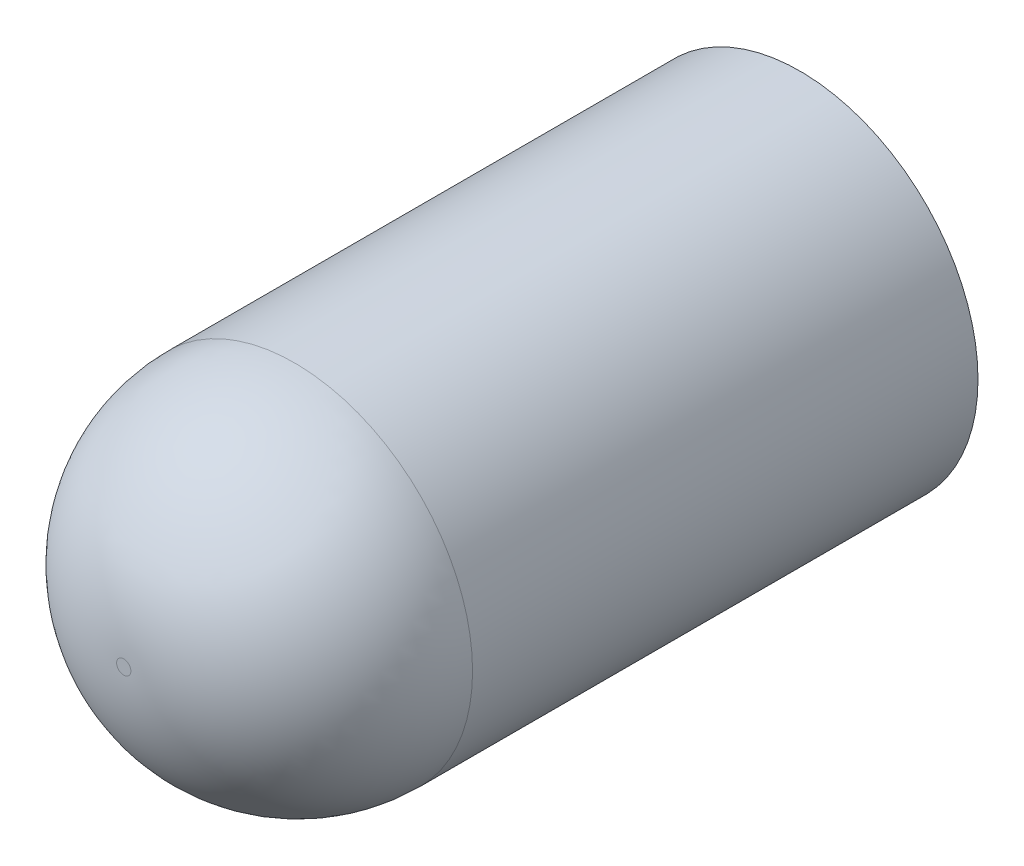
ISO-10303-21;
HEADER;
FILE_DESCRIPTION(('STEP AP214'),'2;1');
FILE_NAME('part.step','',(''),(''),'','','');
FILE_SCHEMA(('AUTOMOTIVE_DESIGN { 1 0 10303 214 1 1 1 1 }'));
ENDSEC;
DATA;
#1=APPLICATION_CONTEXT('core data for automotive mechanical design processes');
#2=APPLICATION_PROTOCOL_DEFINITION('international standard','automotive_design',2000,#1);
#3=PRODUCT_CONTEXT('',#1,'mechanical');
#4=PRODUCT('Part','Part','',(#3));
#5=PRODUCT_RELATED_PRODUCT_CATEGORY('part','',(#4));
#6=PRODUCT_DEFINITION_FORMATION('','',#4);
#7=PRODUCT_DEFINITION_CONTEXT('part definition',#1,'design');
#8=PRODUCT_DEFINITION('design','',#6,#7);
#9=PRODUCT_DEFINITION_SHAPE('','',#8);
#10=(LENGTH_UNIT() NAMED_UNIT(*) SI_UNIT(.MILLI.,.METRE.));
#11=(NAMED_UNIT(*) PLANE_ANGLE_UNIT() SI_UNIT($,.RADIAN.));
#12=(NAMED_UNIT(*) SI_UNIT($,.STERADIAN.) SOLID_ANGLE_UNIT());
#13=UNCERTAINTY_MEASURE_WITH_UNIT(LENGTH_MEASURE(1.E-05),#10,'distance_accuracy_value','');
#14=(GEOMETRIC_REPRESENTATION_CONTEXT(3) GLOBAL_UNCERTAINTY_ASSIGNED_CONTEXT((#13)) GLOBAL_UNIT_ASSIGNED_CONTEXT((#10,
#11,#12)) REPRESENTATION_CONTEXT('',''));
#15=CARTESIAN_POINT('',(0.,0.,0.));
#16=DIRECTION('',(0.,0.,1.));
#17=DIRECTION('',(1.,0.,0.));
#18=AXIS2_PLACEMENT_3D('',#15,#16,#17);
#19=CARTESIAN_POINT('',(0.,15.,-7.));
#20=DIRECTION('',(0.,0.,1.));
#21=DIRECTION('',(1.,0.,0.));
#22=AXIS2_PLACEMENT_3D('',#19,#20,#21);
#23=CYLINDRICAL_SURFACE('',#22,2.5);
#24=CARTESIAN_POINT('',(0.,15.,0.1));
#25=DIRECTION('',(0.,0.,1.));
#26=DIRECTION('',(1.,0.,0.));
#27=AXIS2_PLACEMENT_3D('',#24,#25,#26);
#28=CIRCLE('',#27,2.5);
#29=CARTESIAN_POINT('',(2.50000000000001,15.,0.1));
#30=VERTEX_POINT('',#29);
#31=EDGE_CURVE('E10',#30,#30,#28,.F.);
#32=ORIENTED_EDGE('',*,*,#31,.T.);
#33=EDGE_LOOP('',(#32));
#34=FACE_BOUND('',#33,.T.);
#35=CARTESIAN_POINT('',(0.,15.,-7.));
#36=DIRECTION('',(0.,0.,1.));
#37=DIRECTION('',(1.,0.,0.));
#38=AXIS2_PLACEMENT_3D('',#35,#36,#37);
#39=CIRCLE('',#38,2.5);
#40=CARTESIAN_POINT('',(2.50000000000001,15.,-7.));
#41=VERTEX_POINT('',#40);
#42=EDGE_CURVE('E46',#41,#41,#39,.T.);
#43=ORIENTED_EDGE('',*,*,#42,.T.);
#44=EDGE_LOOP('',(#43));
#45=FACE_BOUND('',#44,.T.);
#46=ADVANCED_FACE('F35',(#34,#45),#23,.T.);
#47=CARTESIAN_POINT('',(0.,15.,-7.));
#48=DIRECTION('',(0.,0.,1.));
#49=DIRECTION('',(1.,0.,0.));
#50=AXIS2_PLACEMENT_3D('',#47,#48,#49);
#51=PLANE('',#50);
#52=ORIENTED_EDGE('',*,*,#42,.F.);
#53=EDGE_LOOP('',(#52));
#54=FACE_BOUND('',#53,.T.);
#55=ADVANCED_FACE('F54',(#54),#51,.F.);
#56=CARTESIAN_POINT('',(0.,15.,2.5));
#57=DIRECTION('',(0.,0.,1.));
#58=DIRECTION('',(1.,0.,0.));
#59=AXIS2_PLACEMENT_3D('',#56,#57,#58);
#60=PLANE('',#59);
#61=CARTESIAN_POINT('',(0.,15.,2.5));
#62=DIRECTION('',(0.,0.,1.));
#63=DIRECTION('',(1.,0.,0.));
#64=AXIS2_PLACEMENT_3D('',#61,#62,#63);
#65=CIRCLE('',#64,0.1);
#66=CARTESIAN_POINT('',(0.100000000000011,15.,2.5));
#67=VERTEX_POINT('',#66);
#68=EDGE_CURVE('E42',#67,#67,#65,.T.);
#69=ORIENTED_EDGE('',*,*,#68,.T.);
#70=EDGE_LOOP('',(#69));
#71=FACE_BOUND('',#70,.T.);
#72=ADVANCED_FACE('F56',(#71),#60,.T.);
#73=CARTESIAN_POINT('',(0.,15.,0.1));
#74=DIRECTION('',(0.,0.,1.));
#75=DIRECTION('',(1.,0.,0.));
#76=AXIS2_PLACEMENT_3D('',#73,#74,#75);
#77=DEGENERATE_TOROIDAL_SURFACE('',#76,0.1,2.4,.T.);
#78=ORIENTED_EDGE('',*,*,#31,.F.);
#79=EDGE_LOOP('',(#78));
#80=FACE_BOUND('',#79,.T.);
#81=ORIENTED_EDGE('',*,*,#68,.F.);
#82=EDGE_LOOP('',(#81));
#83=FACE_BOUND('',#82,.T.);
#84=ADVANCED_FACE('F37',(#80,#83),#77,.T.);
#85=CLOSED_SHELL('',(#46,#55,#72,#84));
#86=MANIFOLD_SOLID_BREP('B2',#85);
#87=ADVANCED_BREP_SHAPE_REPRESENTATION('',(#18,#86),#14);
#88=SHAPE_DEFINITION_REPRESENTATION(#9,#87);
ENDSEC;
END-ISO-10303-21;
